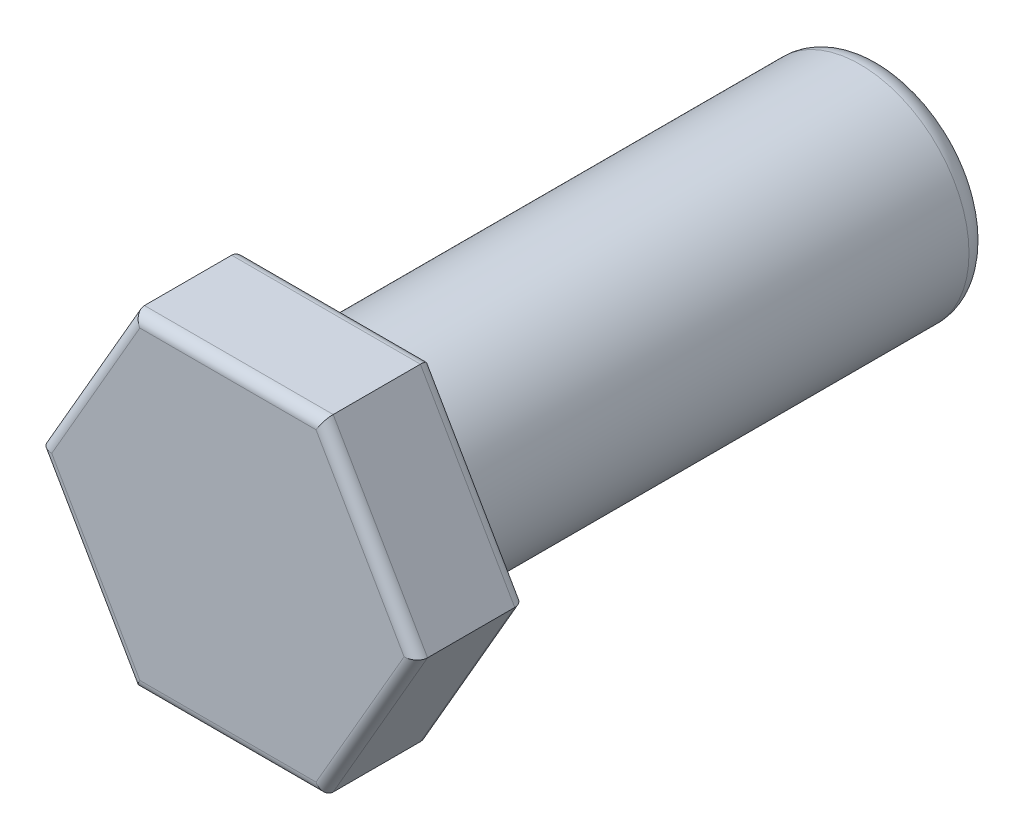
ISO-10303-21;
HEADER;
FILE_DESCRIPTION(('STEP AP214'),'2;1');
FILE_NAME('part.step','',(''),(''),'','','');
FILE_SCHEMA(('AUTOMOTIVE_DESIGN { 1 0 10303 214 1 1 1 1 }'));
ENDSEC;
DATA;
#1=APPLICATION_CONTEXT('core data for automotive mechanical design processes');
#2=APPLICATION_PROTOCOL_DEFINITION('international standard','automotive_design',2000,#1);
#3=PRODUCT_CONTEXT('',#1,'mechanical');
#4=PRODUCT('Part','Part','',(#3));
#5=PRODUCT_RELATED_PRODUCT_CATEGORY('part','',(#4));
#6=PRODUCT_DEFINITION_FORMATION('','',#4);
#7=PRODUCT_DEFINITION_CONTEXT('part definition',#1,'design');
#8=PRODUCT_DEFINITION('design','',#6,#7);
#9=PRODUCT_DEFINITION_SHAPE('','',#8);
#10=(LENGTH_UNIT() NAMED_UNIT(*) SI_UNIT(.MILLI.,.METRE.));
#11=(NAMED_UNIT(*) PLANE_ANGLE_UNIT() SI_UNIT($,.RADIAN.));
#12=(NAMED_UNIT(*) SI_UNIT($,.STERADIAN.) SOLID_ANGLE_UNIT());
#13=UNCERTAINTY_MEASURE_WITH_UNIT(LENGTH_MEASURE(1.E-05),#10,'distance_accuracy_value','');
#14=(GEOMETRIC_REPRESENTATION_CONTEXT(3) GLOBAL_UNCERTAINTY_ASSIGNED_CONTEXT((#13)) GLOBAL_UNIT_ASSIGNED_CONTEXT((#10,
#11,#12)) REPRESENTATION_CONTEXT('',''));
#15=CARTESIAN_POINT('',(0.,0.,0.));
#16=DIRECTION('',(0.,0.,1.));
#17=DIRECTION('',(1.,0.,0.));
#18=AXIS2_PLACEMENT_3D('',#15,#16,#17);
#19=CARTESIAN_POINT('',(0.,0.,25.));
#20=DIRECTION('',(0.,0.,-1.));
#21=DIRECTION('',(-1.,0.,0.));
#22=AXIS2_PLACEMENT_3D('',#19,#20,#21);
#23=CYLINDRICAL_SURFACE('',#22,5.);
#24=CARTESIAN_POINT('',(0.,0.,1.));
#25=DIRECTION('',(0.,0.,1.));
#26=DIRECTION('',(1.,0.,0.));
#27=AXIS2_PLACEMENT_3D('',#24,#25,#26);
#28=CIRCLE('',#27,5.);
#29=CARTESIAN_POINT('',(5.,0.,1.));
#30=VERTEX_POINT('',#29);
#31=EDGE_CURVE('E258',#30,#30,#28,.T.);
#32=ORIENTED_EDGE('',*,*,#31,.T.);
#33=EDGE_LOOP('',(#32));
#34=FACE_BOUND('',#33,.T.);
#35=CARTESIAN_POINT('',(0.,0.,25.));
#36=DIRECTION('',(0.,0.,1.));
#37=DIRECTION('',(1.,0.,0.));
#38=AXIS2_PLACEMENT_3D('',#35,#36,#37);
#39=CIRCLE('',#38,5.);
#40=CARTESIAN_POINT('',(5.,0.,25.));
#41=VERTEX_POINT('',#40);
#42=EDGE_CURVE('E254',#41,#41,#39,.T.);
#43=ORIENTED_EDGE('',*,*,#42,.F.);
#44=EDGE_LOOP('',(#43));
#45=FACE_BOUND('',#44,.T.);
#46=ADVANCED_FACE('F34',(#34,#45),#23,.T.);
#47=CARTESIAN_POINT('',(0.,0.,0.));
#48=DIRECTION('',(0.,0.,1.));
#49=DIRECTION('',(1.,0.,0.));
#50=AXIS2_PLACEMENT_3D('',#47,#48,#49);
#51=PLANE('',#50);
#52=CARTESIAN_POINT('',(0.,0.,0.));
#53=DIRECTION('',(0.,0.,1.));
#54=DIRECTION('',(1.,0.,0.));
#55=AXIS2_PLACEMENT_3D('',#52,#53,#54);
#56=CIRCLE('',#55,4.);
#57=CARTESIAN_POINT('',(4.,0.,0.));
#58=VERTEX_POINT('',#57);
#59=EDGE_CURVE('E146',#58,#58,#56,.F.);
#60=ORIENTED_EDGE('',*,*,#59,.T.);
#61=EDGE_LOOP('',(#60));
#62=FACE_BOUND('',#61,.T.);
#63=ADVANCED_FACE('F290',(#62),#51,.F.);
#64=CARTESIAN_POINT('',(0.,0.,25.));
#65=DIRECTION('',(0.,0.,1.));
#66=DIRECTION('',(1.,0.,0.));
#67=AXIS2_PLACEMENT_3D('',#64,#65,#66);
#68=PLANE('',#67);
#69=DIRECTION('',(-0.5,0.866025403784439,0.));
#70=VECTOR('',#69,1.);
#71=CARTESIAN_POINT('',(6.06217782649107,3.5,25.));
#72=LINE('',#71,#70);
#73=CARTESIAN_POINT('',(4.04145188432738,7.,25.));
#74=VERTEX_POINT('',#73);
#75=CARTESIAN_POINT('',(8.08290376865476,0.,25.));
#76=VERTEX_POINT('',#75);
#77=EDGE_CURVE('E213',#74,#76,#72,.F.);
#78=ORIENTED_EDGE('',*,*,#77,.T.);
#79=DIRECTION('',(0.5,0.866025403784439,0.));
#80=VECTOR('',#79,1.);
#81=CARTESIAN_POINT('',(6.06217782649107,-3.5,25.));
#82=LINE('',#81,#80);
#83=CARTESIAN_POINT('',(4.04145188432738,-7.,25.));
#84=VERTEX_POINT('',#83);
#85=EDGE_CURVE('E219',#76,#84,#82,.F.);
#86=ORIENTED_EDGE('',*,*,#85,.T.);
#87=DIRECTION('',(1.,0.,0.));
#88=VECTOR('',#87,1.);
#89=CARTESIAN_POINT('',(0.,-7.,25.));
#90=LINE('',#89,#88);
#91=CARTESIAN_POINT('',(-4.04145188432738,-7.,25.));
#92=VERTEX_POINT('',#91);
#93=EDGE_CURVE('E217',#84,#92,#90,.F.);
#94=ORIENTED_EDGE('',*,*,#93,.T.);
#95=DIRECTION('',(0.5,-0.866025403784439,0.));
#96=VECTOR('',#95,1.);
#97=CARTESIAN_POINT('',(-6.06217782649107,-3.5,25.));
#98=LINE('',#97,#96);
#99=CARTESIAN_POINT('',(-8.08290376865476,0.,25.));
#100=VERTEX_POINT('',#99);
#101=EDGE_CURVE('E215',#92,#100,#98,.F.);
#102=ORIENTED_EDGE('',*,*,#101,.T.);
#103=DIRECTION('',(-0.5,-0.866025403784439,0.));
#104=VECTOR('',#103,1.);
#105=CARTESIAN_POINT('',(-6.06217782649107,3.5,25.));
#106=LINE('',#105,#104);
#107=CARTESIAN_POINT('',(-4.04145188432738,7.,25.));
#108=VERTEX_POINT('',#107);
#109=EDGE_CURVE('E209',#100,#108,#106,.F.);
#110=ORIENTED_EDGE('',*,*,#109,.T.);
#111=DIRECTION('',(-1.,0.,0.));
#112=VECTOR('',#111,1.);
#113=CARTESIAN_POINT('',(0.,7.,25.));
#114=LINE('',#113,#112);
#115=EDGE_CURVE('E211',#108,#74,#114,.F.);
#116=ORIENTED_EDGE('',*,*,#115,.T.);
#117=EDGE_LOOP('',(#78,#86,#94,#102,#110,#116));
#118=FACE_BOUND('',#117,.T.);
#119=ORIENTED_EDGE('',*,*,#42,.T.);
#120=EDGE_LOOP('',(#119));
#121=FACE_BOUND('',#120,.T.);
#122=ADVANCED_FACE('F296',(#118,#121),#68,.F.);
#123=CARTESIAN_POINT('',(-4.33012701892219,-7.5,30.));
#124=DIRECTION('',(0.,1.,0.));
#125=DIRECTION('',(-1.,0.,0.));
#126=AXIS2_PLACEMENT_3D('',#123,#124,#125);
#127=PLANE('',#126);
#128=DIRECTION('',(0.,0.,-1.));
#129=VECTOR('',#128,1.);
#130=CARTESIAN_POINT('',(4.33012701892219,-7.5,30.));
#131=LINE('',#130,#129);
#132=CARTESIAN_POINT('',(4.33012701892219,-7.5,29.5));
#133=VERTEX_POINT('',#132);
#134=CARTESIAN_POINT('',(4.33012701892219,-7.5,25.5));
#135=VERTEX_POINT('',#134);
#136=EDGE_CURVE('E248',#133,#135,#131,.T.);
#137=ORIENTED_EDGE('',*,*,#136,.F.);
#138=DIRECTION('',(1.,0.,0.));
#139=VECTOR('',#138,1.);
#140=CARTESIAN_POINT('',(-4.33012701892219,-7.5,29.5));
#141=LINE('',#140,#139);
#142=CARTESIAN_POINT('',(-4.33012701892219,-7.5,29.5));
#143=VERTEX_POINT('',#142);
#144=EDGE_CURVE('E207',#133,#143,#141,.F.);
#145=ORIENTED_EDGE('',*,*,#144,.T.);
#146=DIRECTION('',(0.,0.,-1.));
#147=VECTOR('',#146,1.);
#148=CARTESIAN_POINT('',(-4.33012701892219,-7.5,30.));
#149=LINE('',#148,#147);
#150=CARTESIAN_POINT('',(-4.33012701892219,-7.5,25.5));
#151=VERTEX_POINT('',#150);
#152=EDGE_CURVE('E152',#143,#151,#149,.T.);
#153=ORIENTED_EDGE('',*,*,#152,.T.);
#154=DIRECTION('',(1.,0.,0.));
#155=VECTOR('',#154,1.);
#156=CARTESIAN_POINT('',(-4.33012701892219,-7.5,25.5));
#157=LINE('',#156,#155);
#158=EDGE_CURVE('E205',#151,#135,#157,.T.);
#159=ORIENTED_EDGE('',*,*,#158,.T.);
#160=EDGE_LOOP('',(#137,#145,#153,#159));
#161=FACE_BOUND('',#160,.T.);
#162=ADVANCED_FACE('F247',(#161),#127,.F.);
#163=CARTESIAN_POINT('',(4.33012701892219,-7.5,30.));
#164=DIRECTION('',(-0.866025403784439,0.5,0.));
#165=DIRECTION('',(-0.5,-0.866025403784439,0.));
#166=AXIS2_PLACEMENT_3D('',#163,#164,#165);
#167=PLANE('',#166);
#168=DIRECTION('',(0.,0.,-1.));
#169=VECTOR('',#168,1.);
#170=CARTESIAN_POINT('',(8.66025403784439,0.,30.));
#171=LINE('',#170,#169);
#172=CARTESIAN_POINT('',(8.66025403784439,0.,29.5));
#173=VERTEX_POINT('',#172);
#174=CARTESIAN_POINT('',(8.66025403784439,0.,25.5));
#175=VERTEX_POINT('',#174);
#176=EDGE_CURVE('E255',#173,#175,#171,.T.);
#177=ORIENTED_EDGE('',*,*,#176,.F.);
#178=DIRECTION('',(0.5,0.866025403784439,0.));
#179=VECTOR('',#178,1.);
#180=CARTESIAN_POINT('',(4.33012701892219,-7.5,29.5));
#181=LINE('',#180,#179);
#182=EDGE_CURVE('E200',#173,#133,#181,.F.);
#183=ORIENTED_EDGE('',*,*,#182,.T.);
#184=ORIENTED_EDGE('',*,*,#136,.T.);
#185=DIRECTION('',(0.5,0.866025403784439,0.));
#186=VECTOR('',#185,1.);
#187=CARTESIAN_POINT('',(4.33012701892219,-7.5,25.5));
#188=LINE('',#187,#186);
#189=EDGE_CURVE('E253',#135,#175,#188,.T.);
#190=ORIENTED_EDGE('',*,*,#189,.T.);
#191=EDGE_LOOP('',(#177,#183,#184,#190));
#192=FACE_BOUND('',#191,.T.);
#193=ADVANCED_FACE('F252',(#192),#167,.F.);
#194=CARTESIAN_POINT('',(8.66025403784439,0.,30.));
#195=DIRECTION('',(-0.866025403784439,-0.5,0.));
#196=DIRECTION('',(0.5,-0.866025403784439,0.));
#197=AXIS2_PLACEMENT_3D('',#194,#195,#196);
#198=PLANE('',#197);
#199=DIRECTION('',(0.,0.,-1.));
#200=VECTOR('',#199,1.);
#201=CARTESIAN_POINT('',(4.3301270189222,7.5,30.));
#202=LINE('',#201,#200);
#203=CARTESIAN_POINT('',(4.3301270189222,7.5,29.5));
#204=VERTEX_POINT('',#203);
#205=CARTESIAN_POINT('',(4.3301270189222,7.5,25.5));
#206=VERTEX_POINT('',#205);
#207=EDGE_CURVE('E260',#204,#206,#202,.T.);
#208=ORIENTED_EDGE('',*,*,#207,.F.);
#209=DIRECTION('',(-0.5,0.866025403784439,0.));
#210=VECTOR('',#209,1.);
#211=CARTESIAN_POINT('',(8.66025403784439,0.,29.5));
#212=LINE('',#211,#210);
#213=EDGE_CURVE('E190',#204,#173,#212,.F.);
#214=ORIENTED_EDGE('',*,*,#213,.T.);
#215=ORIENTED_EDGE('',*,*,#176,.T.);
#216=DIRECTION('',(-0.5,0.866025403784439,0.));
#217=VECTOR('',#216,1.);
#218=CARTESIAN_POINT('',(8.66025403784439,0.,25.5));
#219=LINE('',#218,#217);
#220=EDGE_CURVE('E196',#175,#206,#219,.T.);
#221=ORIENTED_EDGE('',*,*,#220,.T.);
#222=EDGE_LOOP('',(#208,#214,#215,#221));
#223=FACE_BOUND('',#222,.T.);
#224=ADVANCED_FACE('F327',(#223),#198,.F.);
#225=CARTESIAN_POINT('',(4.3301270189222,7.5,30.));
#226=DIRECTION('',(0.,-1.,0.));
#227=DIRECTION('',(1.,0.,0.));
#228=AXIS2_PLACEMENT_3D('',#225,#226,#227);
#229=PLANE('',#228);
#230=DIRECTION('',(0.,0.,-1.));
#231=VECTOR('',#230,1.);
#232=CARTESIAN_POINT('',(-4.33012701892219,7.5,30.));
#233=LINE('',#232,#231);
#234=CARTESIAN_POINT('',(-4.33012701892219,7.5,29.5));
#235=VERTEX_POINT('',#234);
#236=CARTESIAN_POINT('',(-4.33012701892219,7.5,25.5));
#237=VERTEX_POINT('',#236);
#238=EDGE_CURVE('E227',#235,#237,#233,.T.);
#239=ORIENTED_EDGE('',*,*,#238,.F.);
#240=DIRECTION('',(-1.,0.,0.));
#241=VECTOR('',#240,1.);
#242=CARTESIAN_POINT('',(4.3301270189222,7.5,29.5));
#243=LINE('',#242,#241);
#244=EDGE_CURVE('E149',#235,#204,#243,.F.);
#245=ORIENTED_EDGE('',*,*,#244,.T.);
#246=ORIENTED_EDGE('',*,*,#207,.T.);
#247=DIRECTION('',(-1.,0.,0.));
#248=VECTOR('',#247,1.);
#249=CARTESIAN_POINT('',(4.3301270189222,7.5,25.5));
#250=LINE('',#249,#248);
#251=EDGE_CURVE('E51',#206,#237,#250,.T.);
#252=ORIENTED_EDGE('',*,*,#251,.T.);
#253=EDGE_LOOP('',(#239,#245,#246,#252));
#254=FACE_BOUND('',#253,.T.);
#255=ADVANCED_FACE('F324',(#254),#229,.F.);
#256=CARTESIAN_POINT('',(-4.33012701892219,7.5,30.));
#257=DIRECTION('',(0.866025403784439,-0.5,0.));
#258=DIRECTION('',(0.5,0.866025403784439,0.));
#259=AXIS2_PLACEMENT_3D('',#256,#257,#258);
#260=PLANE('',#259);
#261=DIRECTION('',(0.,0.,-1.));
#262=VECTOR('',#261,1.);
#263=CARTESIAN_POINT('',(-8.66025403784439,0.,30.));
#264=LINE('',#263,#262);
#265=CARTESIAN_POINT('',(-8.66025403784439,0.,29.5));
#266=VERTEX_POINT('',#265);
#267=CARTESIAN_POINT('',(-8.66025403784439,0.,25.5));
#268=VERTEX_POINT('',#267);
#269=EDGE_CURVE('E226',#266,#268,#264,.T.);
#270=ORIENTED_EDGE('',*,*,#269,.F.);
#271=DIRECTION('',(-0.5,-0.866025403784439,0.));
#272=VECTOR('',#271,1.);
#273=CARTESIAN_POINT('',(-4.33012701892219,7.5,29.5));
#274=LINE('',#273,#272);
#275=EDGE_CURVE('E11',#266,#235,#274,.F.);
#276=ORIENTED_EDGE('',*,*,#275,.T.);
#277=ORIENTED_EDGE('',*,*,#238,.T.);
#278=DIRECTION('',(-0.5,-0.866025403784439,0.));
#279=VECTOR('',#278,1.);
#280=CARTESIAN_POINT('',(-4.33012701892219,7.5,25.5));
#281=LINE('',#280,#279);
#282=EDGE_CURVE('E43',#237,#268,#281,.T.);
#283=ORIENTED_EDGE('',*,*,#282,.T.);
#284=EDGE_LOOP('',(#270,#276,#277,#283));
#285=FACE_BOUND('',#284,.T.);
#286=ADVANCED_FACE('F225',(#285),#260,.F.);
#287=CARTESIAN_POINT('',(-8.66025403784439,0.,30.));
#288=DIRECTION('',(0.866025403784439,0.5,0.));
#289=DIRECTION('',(-0.5,0.866025403784439,0.));
#290=AXIS2_PLACEMENT_3D('',#287,#288,#289);
#291=PLANE('',#290);
#292=ORIENTED_EDGE('',*,*,#152,.F.);
#293=DIRECTION('',(0.5,-0.866025403784439,0.));
#294=VECTOR('',#293,1.);
#295=CARTESIAN_POINT('',(-8.66025403784439,0.,29.5));
#296=LINE('',#295,#294);
#297=EDGE_CURVE('E198',#143,#266,#296,.F.);
#298=ORIENTED_EDGE('',*,*,#297,.T.);
#299=ORIENTED_EDGE('',*,*,#269,.T.);
#300=DIRECTION('',(0.5,-0.866025403784439,0.));
#301=VECTOR('',#300,1.);
#302=CARTESIAN_POINT('',(-8.66025403784439,0.,25.5));
#303=LINE('',#302,#301);
#304=EDGE_CURVE('E195',#268,#151,#303,.T.);
#305=ORIENTED_EDGE('',*,*,#304,.T.);
#306=EDGE_LOOP('',(#292,#298,#299,#305));
#307=FACE_BOUND('',#306,.T.);
#308=ADVANCED_FACE('F231',(#307),#291,.F.);
#309=CARTESIAN_POINT('',(0.,0.,30.));
#310=DIRECTION('',(0.,0.,1.));
#311=DIRECTION('',(1.,0.,0.));
#312=AXIS2_PLACEMENT_3D('',#309,#310,#311);
#313=PLANE('',#312);
#314=DIRECTION('',(0.5,-0.866025403784439,0.));
#315=VECTOR('',#314,1.);
#316=CARTESIAN_POINT('',(-3.89711431702997,-7.25,30.));
#317=LINE('',#316,#315);
#318=CARTESIAN_POINT('',(-8.08290376865476,0.,30.));
#319=VERTEX_POINT('',#318);
#320=CARTESIAN_POINT('',(-4.04145188432738,-7.,30.));
#321=VERTEX_POINT('',#320);
#322=EDGE_CURVE('E136',#319,#321,#317,.T.);
#323=ORIENTED_EDGE('',*,*,#322,.T.);
#324=DIRECTION('',(1.,0.,0.));
#325=VECTOR('',#324,1.);
#326=CARTESIAN_POINT('',(4.33012701892219,-7.,30.));
#327=LINE('',#326,#325);
#328=CARTESIAN_POINT('',(4.04145188432738,-7.,30.));
#329=VERTEX_POINT('',#328);
#330=EDGE_CURVE('E272',#321,#329,#327,.T.);
#331=ORIENTED_EDGE('',*,*,#330,.T.);
#332=DIRECTION('',(0.5,0.866025403784439,0.));
#333=VECTOR('',#332,1.);
#334=CARTESIAN_POINT('',(8.22724133595217,0.250000000000001,30.));
#335=LINE('',#334,#333);
#336=CARTESIAN_POINT('',(8.08290376865476,0.,30.));
#337=VERTEX_POINT('',#336);
#338=EDGE_CURVE('E270',#329,#337,#335,.T.);
#339=ORIENTED_EDGE('',*,*,#338,.T.);
#340=DIRECTION('',(-0.5,0.866025403784439,0.));
#341=VECTOR('',#340,1.);
#342=CARTESIAN_POINT('',(3.89711431702998,7.25,30.));
#343=LINE('',#342,#341);
#344=CARTESIAN_POINT('',(4.04145188432738,7.,30.));
#345=VERTEX_POINT('',#344);
#346=EDGE_CURVE('E131',#337,#345,#343,.T.);
#347=ORIENTED_EDGE('',*,*,#346,.T.);
#348=DIRECTION('',(-1.,0.,0.));
#349=VECTOR('',#348,1.);
#350=CARTESIAN_POINT('',(-4.33012701892219,7.,30.));
#351=LINE('',#350,#349);
#352=CARTESIAN_POINT('',(-4.04145188432738,7.,30.));
#353=VERTEX_POINT('',#352);
#354=EDGE_CURVE('E124',#345,#353,#351,.T.);
#355=ORIENTED_EDGE('',*,*,#354,.T.);
#356=DIRECTION('',(-0.5,-0.866025403784439,0.));
#357=VECTOR('',#356,1.);
#358=CARTESIAN_POINT('',(-8.22724133595217,-0.250000000000001,30.));
#359=LINE('',#358,#357);
#360=EDGE_CURVE('E127',#353,#319,#359,.T.);
#361=ORIENTED_EDGE('',*,*,#360,.T.);
#362=EDGE_LOOP('',(#323,#331,#339,#347,#355,#361));
#363=FACE_BOUND('',#362,.T.);
#364=ADVANCED_FACE('F126',(#363),#313,.T.);
#365=CARTESIAN_POINT('',(0.,0.,1.));
#366=DIRECTION('',(0.,0.,1.));
#367=DIRECTION('',(1.,0.,0.));
#368=AXIS2_PLACEMENT_3D('',#365,#366,#367);
#369=TOROIDAL_SURFACE('',#368,4.,1.);
#370=ORIENTED_EDGE('',*,*,#59,.F.);
#371=EDGE_LOOP('',(#370));
#372=FACE_BOUND('',#371,.T.);
#373=ORIENTED_EDGE('',*,*,#31,.F.);
#374=EDGE_LOOP('',(#373));
#375=FACE_BOUND('',#374,.T.);
#376=ADVANCED_FACE('F301',(#372,#375),#369,.T.);
#377=CARTESIAN_POINT('',(-6.06217782649107,3.5,29.5));
#378=DIRECTION('',(0.5,0.866025403784439,0.));
#379=DIRECTION('',(-0.866025403784439,0.5,0.));
#380=AXIS2_PLACEMENT_3D('',#377,#378,#379);
#381=CYLINDRICAL_SURFACE('',#380,0.5);
#382=CARTESIAN_POINT('',(-4.04145188432738,7.,29.5));
#383=DIRECTION('',(0.866025403784438,0.5,0.));
#384=DIRECTION('',(-0.5,0.866025403784439,0.));
#385=AXIS2_PLACEMENT_3D('',#382,#383,#384);
#386=ELLIPSE('',#385,0.577350269189626,0.5);
#387=EDGE_CURVE('E141',#235,#353,#386,.T.);
#388=ORIENTED_EDGE('',*,*,#387,.F.);
#389=ORIENTED_EDGE('',*,*,#275,.F.);
#390=CARTESIAN_POINT('',(-8.08290376865476,0.,29.5));
#391=DIRECTION('',(0.,1.,0.));
#392=DIRECTION('',(1.,0.,0.));
#393=AXIS2_PLACEMENT_3D('',#390,#391,#392);
#394=ELLIPSE('',#393,0.577350269189626,0.5);
#395=EDGE_CURVE('E144',#319,#266,#394,.F.);
#396=ORIENTED_EDGE('',*,*,#395,.F.);
#397=ORIENTED_EDGE('',*,*,#360,.F.);
#398=EDGE_LOOP('',(#388,#389,#396,#397));
#399=FACE_BOUND('',#398,.T.);
#400=ADVANCED_FACE('F140',(#399),#381,.T.);
#401=CARTESIAN_POINT('',(-6.06217782649107,-3.5,29.5));
#402=DIRECTION('',(-0.5,0.866025403784439,0.));
#403=DIRECTION('',(-0.866025403784439,-0.5,0.));
#404=AXIS2_PLACEMENT_3D('',#401,#402,#403);
#405=CYLINDRICAL_SURFACE('',#404,0.5);
#406=ORIENTED_EDGE('',*,*,#395,.T.);
#407=ORIENTED_EDGE('',*,*,#297,.F.);
#408=CARTESIAN_POINT('',(-4.04145188432738,-7.,29.5));
#409=DIRECTION('',(-0.866025403784439,0.5,0.));
#410=DIRECTION('',(-0.5,-0.866025403784439,0.));
#411=AXIS2_PLACEMENT_3D('',#408,#409,#410);
#412=ELLIPSE('',#411,0.577350269189626,0.5);
#413=EDGE_CURVE('E150',#321,#143,#412,.F.);
#414=ORIENTED_EDGE('',*,*,#413,.F.);
#415=ORIENTED_EDGE('',*,*,#322,.F.);
#416=EDGE_LOOP('',(#406,#407,#414,#415));
#417=FACE_BOUND('',#416,.T.);
#418=ADVANCED_FACE('F308',(#417),#405,.T.);
#419=CARTESIAN_POINT('',(0.,7.,29.5));
#420=DIRECTION('',(1.,0.,0.));
#421=DIRECTION('',(0.,1.,0.));
#422=AXIS2_PLACEMENT_3D('',#419,#420,#421);
#423=CYLINDRICAL_SURFACE('',#422,0.5);
#424=ORIENTED_EDGE('',*,*,#387,.T.);
#425=ORIENTED_EDGE('',*,*,#354,.F.);
#426=CARTESIAN_POINT('',(4.04145188432738,7.,29.5));
#427=DIRECTION('',(0.866025403784439,-0.5,0.));
#428=DIRECTION('',(0.5,0.866025403784439,0.));
#429=AXIS2_PLACEMENT_3D('',#426,#427,#428);
#430=ELLIPSE('',#429,0.577350269189626,0.5);
#431=EDGE_CURVE('E155',#204,#345,#430,.T.);
#432=ORIENTED_EDGE('',*,*,#431,.F.);
#433=ORIENTED_EDGE('',*,*,#244,.F.);
#434=EDGE_LOOP('',(#424,#425,#432,#433));
#435=FACE_BOUND('',#434,.T.);
#436=ADVANCED_FACE('F148',(#435),#423,.T.);
#437=CARTESIAN_POINT('',(0.,-7.,29.5));
#438=DIRECTION('',(-1.,0.,0.));
#439=DIRECTION('',(0.,-1.,0.));
#440=AXIS2_PLACEMENT_3D('',#437,#438,#439);
#441=CYLINDRICAL_SURFACE('',#440,0.5);
#442=ORIENTED_EDGE('',*,*,#413,.T.);
#443=ORIENTED_EDGE('',*,*,#144,.F.);
#444=CARTESIAN_POINT('',(4.04145188432738,-7.,29.5));
#445=DIRECTION('',(-0.866025403784438,-0.5,0.));
#446=DIRECTION('',(-0.5,0.866025403784439,0.));
#447=AXIS2_PLACEMENT_3D('',#444,#445,#446);
#448=ELLIPSE('',#447,0.577350269189626,0.5);
#449=EDGE_CURVE('E179',#329,#133,#448,.F.);
#450=ORIENTED_EDGE('',*,*,#449,.F.);
#451=ORIENTED_EDGE('',*,*,#330,.F.);
#452=EDGE_LOOP('',(#442,#443,#450,#451));
#453=FACE_BOUND('',#452,.T.);
#454=ADVANCED_FACE('F279',(#453),#441,.T.);
#455=CARTESIAN_POINT('',(6.06217782649107,3.5,29.5));
#456=DIRECTION('',(0.5,-0.866025403784439,0.));
#457=DIRECTION('',(0.866025403784439,0.5,0.));
#458=AXIS2_PLACEMENT_3D('',#455,#456,#457);
#459=CYLINDRICAL_SURFACE('',#458,0.5);
#460=ORIENTED_EDGE('',*,*,#431,.T.);
#461=ORIENTED_EDGE('',*,*,#346,.F.);
#462=CARTESIAN_POINT('',(8.08290376865476,0.,29.5));
#463=DIRECTION('',(0.,-1.,0.));
#464=DIRECTION('',(1.,0.,0.));
#465=AXIS2_PLACEMENT_3D('',#462,#463,#464);
#466=ELLIPSE('',#465,0.577350269189626,0.5);
#467=EDGE_CURVE('E174',#173,#337,#466,.T.);
#468=ORIENTED_EDGE('',*,*,#467,.F.);
#469=ORIENTED_EDGE('',*,*,#213,.F.);
#470=EDGE_LOOP('',(#460,#461,#468,#469));
#471=FACE_BOUND('',#470,.T.);
#472=ADVANCED_FACE('F189',(#471),#459,.T.);
#473=CARTESIAN_POINT('',(6.06217782649107,-3.5,29.5));
#474=DIRECTION('',(-0.5,-0.866025403784439,0.));
#475=DIRECTION('',(0.866025403784439,-0.5,0.));
#476=AXIS2_PLACEMENT_3D('',#473,#474,#475);
#477=CYLINDRICAL_SURFACE('',#476,0.5);
#478=ORIENTED_EDGE('',*,*,#449,.T.);
#479=ORIENTED_EDGE('',*,*,#182,.F.);
#480=ORIENTED_EDGE('',*,*,#467,.T.);
#481=ORIENTED_EDGE('',*,*,#338,.F.);
#482=EDGE_LOOP('',(#478,#479,#480,#481));
#483=FACE_BOUND('',#482,.T.);
#484=ADVANCED_FACE('F280',(#483),#477,.T.);
#485=CARTESIAN_POINT('',(-3.89711431702997,7.25,25.5));
#486=DIRECTION('',(-0.5,-0.866025403784439,0.));
#487=DIRECTION('',(0.866025403784439,-0.5,0.));
#488=AXIS2_PLACEMENT_3D('',#485,#486,#487);
#489=CYLINDRICAL_SURFACE('',#488,0.5);
#490=CARTESIAN_POINT('',(-4.04145188432738,7.,25.5));
#491=DIRECTION('',(-0.866025403784438,-0.5,0.));
#492=DIRECTION('',(0.5,-0.866025403784439,0.));
#493=AXIS2_PLACEMENT_3D('',#490,#491,#492);
#494=ELLIPSE('',#493,0.577350269189626,0.5);
#495=EDGE_CURVE('E168',#108,#237,#494,.F.);
#496=ORIENTED_EDGE('',*,*,#495,.F.);
#497=ORIENTED_EDGE('',*,*,#109,.F.);
#498=CARTESIAN_POINT('',(-8.08290376865476,0.,25.5));
#499=DIRECTION('',(0.,-1.,0.));
#500=DIRECTION('',(-1.,0.,0.));
#501=AXIS2_PLACEMENT_3D('',#498,#499,#500);
#502=ELLIPSE('',#501,0.577350269189626,0.5);
#503=EDGE_CURVE('E38',#268,#100,#502,.T.);
#504=ORIENTED_EDGE('',*,*,#503,.F.);
#505=ORIENTED_EDGE('',*,*,#282,.F.);
#506=EDGE_LOOP('',(#496,#497,#504,#505));
#507=FACE_BOUND('',#506,.T.);
#508=ADVANCED_FACE('F36',(#507),#489,.T.);
#509=CARTESIAN_POINT('',(-8.22724133595217,0.25,25.5));
#510=DIRECTION('',(0.5,-0.866025403784439,0.));
#511=DIRECTION('',(0.866025403784439,0.5,0.));
#512=AXIS2_PLACEMENT_3D('',#509,#510,#511);
#513=CYLINDRICAL_SURFACE('',#512,0.5);
#514=ORIENTED_EDGE('',*,*,#503,.T.);
#515=ORIENTED_EDGE('',*,*,#101,.F.);
#516=CARTESIAN_POINT('',(-4.04145188432738,-7.,25.5));
#517=DIRECTION('',(0.866025403784439,-0.5,0.));
#518=DIRECTION('',(-0.5,-0.866025403784439,0.));
#519=AXIS2_PLACEMENT_3D('',#516,#517,#518);
#520=ELLIPSE('',#519,0.577350269189626,0.5);
#521=EDGE_CURVE('E166',#151,#92,#520,.T.);
#522=ORIENTED_EDGE('',*,*,#521,.F.);
#523=ORIENTED_EDGE('',*,*,#304,.F.);
#524=EDGE_LOOP('',(#514,#515,#522,#523));
#525=FACE_BOUND('',#524,.T.);
#526=ADVANCED_FACE('F237',(#525),#513,.T.);
#527=CARTESIAN_POINT('',(4.3301270189222,7.,25.5));
#528=DIRECTION('',(-1.,0.,0.));
#529=DIRECTION('',(0.,-1.,0.));
#530=AXIS2_PLACEMENT_3D('',#527,#528,#529);
#531=CYLINDRICAL_SURFACE('',#530,0.5);
#532=ORIENTED_EDGE('',*,*,#495,.T.);
#533=ORIENTED_EDGE('',*,*,#251,.F.);
#534=CARTESIAN_POINT('',(4.04145188432738,7.,25.5));
#535=DIRECTION('',(-0.866025403784439,0.5,0.));
#536=DIRECTION('',(-0.5,-0.866025403784439,0.));
#537=AXIS2_PLACEMENT_3D('',#534,#535,#536);
#538=ELLIPSE('',#537,0.577350269189626,0.5);
#539=EDGE_CURVE('E163',#74,#206,#538,.F.);
#540=ORIENTED_EDGE('',*,*,#539,.F.);
#541=ORIENTED_EDGE('',*,*,#115,.F.);
#542=EDGE_LOOP('',(#532,#533,#540,#541));
#543=FACE_BOUND('',#542,.T.);
#544=ADVANCED_FACE('F417',(#543),#531,.T.);
#545=CARTESIAN_POINT('',(-4.33012701892219,-7.,25.5));
#546=DIRECTION('',(1.,0.,0.));
#547=DIRECTION('',(0.,1.,0.));
#548=AXIS2_PLACEMENT_3D('',#545,#546,#547);
#549=CYLINDRICAL_SURFACE('',#548,0.5);
#550=ORIENTED_EDGE('',*,*,#521,.T.);
#551=ORIENTED_EDGE('',*,*,#93,.F.);
#552=CARTESIAN_POINT('',(4.04145188432738,-7.,25.5));
#553=DIRECTION('',(0.866025403784438,0.5,0.));
#554=DIRECTION('',(0.5,-0.866025403784439,0.));
#555=AXIS2_PLACEMENT_3D('',#552,#553,#554);
#556=ELLIPSE('',#555,0.577350269189626,0.5);
#557=EDGE_CURVE('E161',#135,#84,#556,.T.);
#558=ORIENTED_EDGE('',*,*,#557,.F.);
#559=ORIENTED_EDGE('',*,*,#158,.F.);
#560=EDGE_LOOP('',(#550,#551,#558,#559));
#561=FACE_BOUND('',#560,.T.);
#562=ADVANCED_FACE('F242',(#561),#549,.T.);
#563=CARTESIAN_POINT('',(8.22724133595217,-0.249999999999999,25.5));
#564=DIRECTION('',(-0.5,0.866025403784439,0.));
#565=DIRECTION('',(-0.866025403784439,-0.5,0.));
#566=AXIS2_PLACEMENT_3D('',#563,#564,#565);
#567=CYLINDRICAL_SURFACE('',#566,0.5);
#568=ORIENTED_EDGE('',*,*,#539,.T.);
#569=ORIENTED_EDGE('',*,*,#220,.F.);
#570=CARTESIAN_POINT('',(8.08290376865476,0.,25.5));
#571=DIRECTION('',(0.,1.,0.));
#572=DIRECTION('',(-1.,0.,0.));
#573=AXIS2_PLACEMENT_3D('',#570,#571,#572);
#574=ELLIPSE('',#573,0.577350269189626,0.5);
#575=EDGE_CURVE('E159',#76,#175,#574,.F.);
#576=ORIENTED_EDGE('',*,*,#575,.F.);
#577=ORIENTED_EDGE('',*,*,#77,.F.);
#578=EDGE_LOOP('',(#568,#569,#576,#577));
#579=FACE_BOUND('',#578,.T.);
#580=ADVANCED_FACE('F433',(#579),#567,.T.);
#581=CARTESIAN_POINT('',(3.89711431702997,-7.25,25.5));
#582=DIRECTION('',(0.5,0.866025403784439,0.));
#583=DIRECTION('',(-0.866025403784439,0.5,0.));
#584=AXIS2_PLACEMENT_3D('',#581,#582,#583);
#585=CYLINDRICAL_SURFACE('',#584,0.5);
#586=ORIENTED_EDGE('',*,*,#557,.T.);
#587=ORIENTED_EDGE('',*,*,#85,.F.);
#588=ORIENTED_EDGE('',*,*,#575,.T.);
#589=ORIENTED_EDGE('',*,*,#189,.F.);
#590=EDGE_LOOP('',(#586,#587,#588,#589));
#591=FACE_BOUND('',#590,.T.);
#592=ADVANCED_FACE('F442',(#591),#585,.T.);
#593=CLOSED_SHELL('',(#46,#63,#122,#162,#193,#224,#255,#286,#308,#364,#376,#400,#418,#436,#454,
#472,#484,#508,#526,#544,#562,#580,#592));
#594=MANIFOLD_SOLID_BREP('B2',#593);
#595=ADVANCED_BREP_SHAPE_REPRESENTATION('',(#18,#594),#14);
#596=SHAPE_DEFINITION_REPRESENTATION(#9,#595);
ENDSEC;
END-ISO-10303-21;
